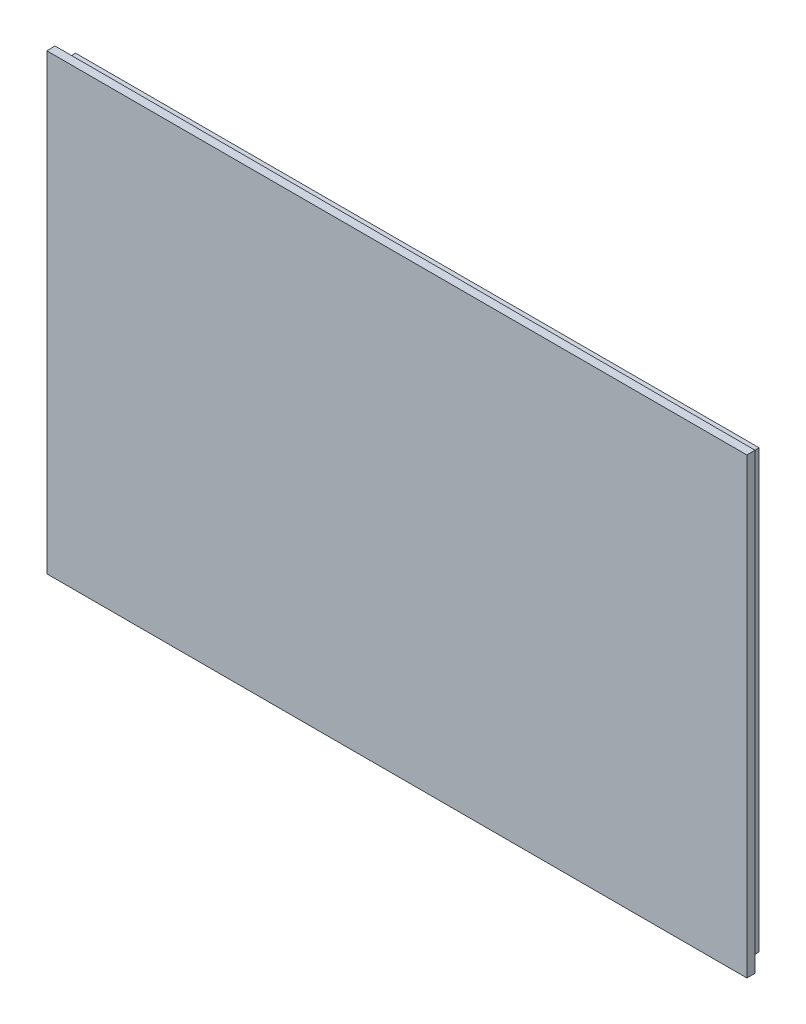
ISO-10303-21;
HEADER;
FILE_DESCRIPTION(('STEP AP214'),'2;1');
FILE_NAME('part.step','',(''),(''),'','','');
FILE_SCHEMA(('AUTOMOTIVE_DESIGN { 1 0 10303 214 1 1 1 1 }'));
ENDSEC;
DATA;
#1=APPLICATION_CONTEXT('core data for automotive mechanical design processes');
#2=APPLICATION_PROTOCOL_DEFINITION('international standard','automotive_design',2000,#1);
#3=PRODUCT_CONTEXT('',#1,'mechanical');
#4=PRODUCT('Part','Part','',(#3));
#5=PRODUCT_RELATED_PRODUCT_CATEGORY('part','',(#4));
#6=PRODUCT_DEFINITION_FORMATION('','',#4);
#7=PRODUCT_DEFINITION_CONTEXT('part definition',#1,'design');
#8=PRODUCT_DEFINITION('design','',#6,#7);
#9=PRODUCT_DEFINITION_SHAPE('','',#8);
#10=(LENGTH_UNIT() NAMED_UNIT(*) SI_UNIT(.MILLI.,.METRE.));
#11=(NAMED_UNIT(*) PLANE_ANGLE_UNIT() SI_UNIT($,.RADIAN.));
#12=(NAMED_UNIT(*) SI_UNIT($,.STERADIAN.) SOLID_ANGLE_UNIT());
#13=UNCERTAINTY_MEASURE_WITH_UNIT(LENGTH_MEASURE(1.E-05),#10,'distance_accuracy_value','');
#14=(GEOMETRIC_REPRESENTATION_CONTEXT(3) GLOBAL_UNCERTAINTY_ASSIGNED_CONTEXT((#13)) GLOBAL_UNIT_ASSIGNED_CONTEXT((#10,
#11,#12)) REPRESENTATION_CONTEXT('',''));
#15=CARTESIAN_POINT('',(0.,0.,0.));
#16=DIRECTION('',(0.,0.,1.));
#17=DIRECTION('',(1.,0.,0.));
#18=AXIS2_PLACEMENT_3D('',#15,#16,#17);
#19=CARTESIAN_POINT('',(85.,55.,2.));
#20=DIRECTION('',(-1.,0.,0.));
#21=DIRECTION('',(0.,-1.,0.));
#22=AXIS2_PLACEMENT_3D('',#19,#20,#21);
#23=PLANE('',#22);
#24=DIRECTION('',(0.,1.,0.));
#25=VECTOR('',#24,1.);
#26=CARTESIAN_POINT('',(85.,55.,0.));
#27=LINE('',#26,#25);
#28=CARTESIAN_POINT('',(85.,-55.,0.));
#29=VERTEX_POINT('',#28);
#30=CARTESIAN_POINT('',(85.,55.,0.));
#31=VERTEX_POINT('',#30);
#32=EDGE_CURVE('E174',#29,#31,#27,.T.);
#33=ORIENTED_EDGE('',*,*,#32,.T.);
#34=DIRECTION('',(0.,0.,-1.));
#35=VECTOR('',#34,1.);
#36=CARTESIAN_POINT('',(85.,55.,2.));
#37=LINE('',#36,#35);
#38=CARTESIAN_POINT('',(85.,55.,2.));
#39=VERTEX_POINT('',#38);
#40=EDGE_CURVE('E207',#39,#31,#37,.T.);
#41=ORIENTED_EDGE('',*,*,#40,.F.);
#42=DIRECTION('',(0.,1.,0.));
#43=VECTOR('',#42,1.);
#44=CARTESIAN_POINT('',(85.,55.,2.));
#45=LINE('',#44,#43);
#46=CARTESIAN_POINT('',(85.,-55.,2.));
#47=VERTEX_POINT('',#46);
#48=EDGE_CURVE('E181',#47,#39,#45,.T.);
#49=ORIENTED_EDGE('',*,*,#48,.F.);
#50=DIRECTION('',(0.,0.,-1.));
#51=VECTOR('',#50,1.);
#52=CARTESIAN_POINT('',(85.,-55.,2.));
#53=LINE('',#52,#51);
#54=EDGE_CURVE('E191',#47,#29,#53,.T.);
#55=ORIENTED_EDGE('',*,*,#54,.T.);
#56=EDGE_LOOP('',(#33,#41,#49,#55));
#57=FACE_BOUND('',#56,.T.);
#58=ADVANCED_FACE('F37',(#57),#23,.F.);
#59=CARTESIAN_POINT('',(-85.,55.,2.));
#60=DIRECTION('',(0.,-1.,0.));
#61=DIRECTION('',(0.,0.,-1.));
#62=AXIS2_PLACEMENT_3D('',#59,#60,#61);
#63=PLANE('',#62);
#64=DIRECTION('',(-1.,0.,0.));
#65=VECTOR('',#64,1.);
#66=CARTESIAN_POINT('',(-85.,55.,0.));
#67=LINE('',#66,#65);
#68=CARTESIAN_POINT('',(-85.,55.,0.));
#69=VERTEX_POINT('',#68);
#70=EDGE_CURVE('E194',#31,#69,#67,.T.);
#71=ORIENTED_EDGE('',*,*,#70,.T.);
#72=DIRECTION('',(0.,0.,-1.));
#73=VECTOR('',#72,1.);
#74=CARTESIAN_POINT('',(-85.,55.,2.));
#75=LINE('',#74,#73);
#76=CARTESIAN_POINT('',(-85.,55.,2.));
#77=VERTEX_POINT('',#76);
#78=EDGE_CURVE('E204',#77,#69,#75,.T.);
#79=ORIENTED_EDGE('',*,*,#78,.F.);
#80=DIRECTION('',(-1.,0.,0.));
#81=VECTOR('',#80,1.);
#82=CARTESIAN_POINT('',(-85.,55.,2.));
#83=LINE('',#82,#81);
#84=EDGE_CURVE('E184',#39,#77,#83,.T.);
#85=ORIENTED_EDGE('',*,*,#84,.F.);
#86=ORIENTED_EDGE('',*,*,#40,.T.);
#87=EDGE_LOOP('',(#71,#79,#85,#86));
#88=FACE_BOUND('',#87,.T.);
#89=ADVANCED_FACE('F249',(#88),#63,.F.);
#90=CARTESIAN_POINT('',(-85.,55.,2.));
#91=DIRECTION('',(1.,0.,0.));
#92=DIRECTION('',(0.,1.,0.));
#93=AXIS2_PLACEMENT_3D('',#90,#91,#92);
#94=PLANE('',#93);
#95=DIRECTION('',(0.,-1.,0.));
#96=VECTOR('',#95,1.);
#97=CARTESIAN_POINT('',(-85.,55.,0.));
#98=LINE('',#97,#96);
#99=CARTESIAN_POINT('',(-85.,-55.,0.));
#100=VERTEX_POINT('',#99);
#101=EDGE_CURVE('E196',#69,#100,#98,.T.);
#102=ORIENTED_EDGE('',*,*,#101,.T.);
#103=DIRECTION('',(0.,0.,-1.));
#104=VECTOR('',#103,1.);
#105=CARTESIAN_POINT('',(-85.,-55.,2.));
#106=LINE('',#105,#104);
#107=CARTESIAN_POINT('',(-85.,-55.,2.));
#108=VERTEX_POINT('',#107);
#109=EDGE_CURVE('E201',#108,#100,#106,.T.);
#110=ORIENTED_EDGE('',*,*,#109,.F.);
#111=DIRECTION('',(0.,-1.,0.));
#112=VECTOR('',#111,1.);
#113=CARTESIAN_POINT('',(-85.,55.,2.));
#114=LINE('',#113,#112);
#115=EDGE_CURVE('E187',#77,#108,#114,.T.);
#116=ORIENTED_EDGE('',*,*,#115,.F.);
#117=ORIENTED_EDGE('',*,*,#78,.T.);
#118=EDGE_LOOP('',(#102,#110,#116,#117));
#119=FACE_BOUND('',#118,.T.);
#120=ADVANCED_FACE('F254',(#119),#94,.F.);
#121=CARTESIAN_POINT('',(-85.,-55.,2.));
#122=DIRECTION('',(0.,1.,0.));
#123=DIRECTION('',(0.,0.,1.));
#124=AXIS2_PLACEMENT_3D('',#121,#122,#123);
#125=PLANE('',#124);
#126=DIRECTION('',(1.,0.,0.));
#127=VECTOR('',#126,1.);
#128=CARTESIAN_POINT('',(-85.,-55.,0.));
#129=LINE('',#128,#127);
#130=EDGE_CURVE('E185',#100,#29,#129,.T.);
#131=ORIENTED_EDGE('',*,*,#130,.T.);
#132=ORIENTED_EDGE('',*,*,#54,.F.);
#133=DIRECTION('',(1.,0.,0.));
#134=VECTOR('',#133,1.);
#135=CARTESIAN_POINT('',(-85.,-55.,2.));
#136=LINE('',#135,#134);
#137=EDGE_CURVE('E189',#108,#47,#136,.T.);
#138=ORIENTED_EDGE('',*,*,#137,.F.);
#139=ORIENTED_EDGE('',*,*,#109,.T.);
#140=EDGE_LOOP('',(#131,#132,#138,#139));
#141=FACE_BOUND('',#140,.T.);
#142=ADVANCED_FACE('F269',(#141),#125,.F.);
#143=CARTESIAN_POINT('',(0.,0.,2.));
#144=DIRECTION('',(0.,0.,1.));
#145=DIRECTION('',(1.,0.,0.));
#146=AXIS2_PLACEMENT_3D('',#143,#144,#145);
#147=PLANE('',#146);
#148=ORIENTED_EDGE('',*,*,#48,.T.);
#149=ORIENTED_EDGE('',*,*,#84,.T.);
#150=ORIENTED_EDGE('',*,*,#115,.T.);
#151=ORIENTED_EDGE('',*,*,#137,.T.);
#152=EDGE_LOOP('',(#148,#149,#150,#151));
#153=FACE_BOUND('',#152,.T.);
#154=ADVANCED_FACE('F265',(#153),#147,.T.);
#155=CARTESIAN_POINT('',(0.,0.,0.));
#156=DIRECTION('',(0.,0.,1.));
#157=DIRECTION('',(1.,0.,0.));
#158=AXIS2_PLACEMENT_3D('',#155,#156,#157);
#159=PLANE('',#158);
#160=DIRECTION('',(0.,-1.,0.));
#161=VECTOR('',#160,1.);
#162=CARTESIAN_POINT('',(-83.,0.,0.));
#163=LINE('',#162,#161);
#164=CARTESIAN_POINT('',(-83.,53.,0.));
#165=VERTEX_POINT('',#164);
#166=CARTESIAN_POINT('',(-83.,-53.,0.));
#167=VERTEX_POINT('',#166);
#168=EDGE_CURVE('E44',#165,#167,#163,.T.);
#169=ORIENTED_EDGE('',*,*,#168,.T.);
#170=DIRECTION('',(1.,0.,0.));
#171=VECTOR('',#170,1.);
#172=CARTESIAN_POINT('',(0.,-53.,0.));
#173=LINE('',#172,#171);
#174=CARTESIAN_POINT('',(83.,-53.,0.));
#175=VERTEX_POINT('',#174);
#176=EDGE_CURVE('E11',#167,#175,#173,.T.);
#177=ORIENTED_EDGE('',*,*,#176,.T.);
#178=DIRECTION('',(0.,1.,0.));
#179=VECTOR('',#178,1.);
#180=CARTESIAN_POINT('',(83.,0.,0.));
#181=LINE('',#180,#179);
#182=CARTESIAN_POINT('',(83.,53.,0.));
#183=VERTEX_POINT('',#182);
#184=EDGE_CURVE('E218',#175,#183,#181,.T.);
#185=ORIENTED_EDGE('',*,*,#184,.T.);
#186=DIRECTION('',(-1.,0.,0.));
#187=VECTOR('',#186,1.);
#188=CARTESIAN_POINT('',(0.,53.,0.));
#189=LINE('',#188,#187);
#190=EDGE_CURVE('E221',#183,#165,#189,.T.);
#191=ORIENTED_EDGE('',*,*,#190,.T.);
#192=EDGE_LOOP('',(#169,#177,#185,#191));
#193=FACE_BOUND('',#192,.T.);
#194=ORIENTED_EDGE('',*,*,#32,.F.);
#195=ORIENTED_EDGE('',*,*,#130,.F.);
#196=ORIENTED_EDGE('',*,*,#101,.F.);
#197=ORIENTED_EDGE('',*,*,#70,.F.);
#198=EDGE_LOOP('',(#194,#195,#196,#197));
#199=FACE_BOUND('',#198,.T.);
#200=ADVANCED_FACE('F225',(#193,#199),#159,.F.);
#201=CARTESIAN_POINT('',(-83.,-53.,-3.));
#202=DIRECTION('',(0.,-1.,0.));
#203=DIRECTION('',(0.,0.,-1.));
#204=AXIS2_PLACEMENT_3D('',#201,#202,#203);
#205=PLANE('',#204);
#206=ORIENTED_EDGE('',*,*,#176,.F.);
#207=DIRECTION('',(0.,0.,1.));
#208=VECTOR('',#207,1.);
#209=CARTESIAN_POINT('',(-83.,-53.,-3.));
#210=LINE('',#209,#208);
#211=CARTESIAN_POINT('',(-83.,-53.,-3.));
#212=VERTEX_POINT('',#211);
#213=EDGE_CURVE('E171',#212,#167,#210,.T.);
#214=ORIENTED_EDGE('',*,*,#213,.F.);
#215=DIRECTION('',(1.,0.,0.));
#216=VECTOR('',#215,1.);
#217=CARTESIAN_POINT('',(-83.,-53.,-3.));
#218=LINE('',#217,#216);
#219=CARTESIAN_POINT('',(83.,-53.,-3.));
#220=VERTEX_POINT('',#219);
#221=EDGE_CURVE('E155',#212,#220,#218,.T.);
#222=ORIENTED_EDGE('',*,*,#221,.T.);
#223=DIRECTION('',(0.,0.,1.));
#224=VECTOR('',#223,1.);
#225=CARTESIAN_POINT('',(83.,-53.,-3.));
#226=LINE('',#225,#224);
#227=EDGE_CURVE('E170',#220,#175,#226,.T.);
#228=ORIENTED_EDGE('',*,*,#227,.T.);
#229=EDGE_LOOP('',(#206,#214,#222,#228));
#230=FACE_BOUND('',#229,.T.);
#231=ADVANCED_FACE('F236',(#230),#205,.T.);
#232=CARTESIAN_POINT('',(-83.,53.,-3.));
#233=DIRECTION('',(-1.,0.,0.));
#234=DIRECTION('',(0.,-1.,0.));
#235=AXIS2_PLACEMENT_3D('',#232,#233,#234);
#236=PLANE('',#235);
#237=ORIENTED_EDGE('',*,*,#168,.F.);
#238=DIRECTION('',(0.,0.,1.));
#239=VECTOR('',#238,1.);
#240=CARTESIAN_POINT('',(-83.,53.,-3.));
#241=LINE('',#240,#239);
#242=CARTESIAN_POINT('',(-83.,53.,-3.));
#243=VERTEX_POINT('',#242);
#244=EDGE_CURVE('E175',#243,#165,#241,.T.);
#245=ORIENTED_EDGE('',*,*,#244,.F.);
#246=DIRECTION('',(0.,-1.,0.));
#247=VECTOR('',#246,1.);
#248=CARTESIAN_POINT('',(-83.,53.,-3.));
#249=LINE('',#248,#247);
#250=EDGE_CURVE('E167',#243,#212,#249,.T.);
#251=ORIENTED_EDGE('',*,*,#250,.T.);
#252=ORIENTED_EDGE('',*,*,#213,.T.);
#253=EDGE_LOOP('',(#237,#245,#251,#252));
#254=FACE_BOUND('',#253,.T.);
#255=ADVANCED_FACE('F228',(#254),#236,.T.);
#256=CARTESIAN_POINT('',(83.,53.,-3.));
#257=DIRECTION('',(0.,1.,0.));
#258=DIRECTION('',(0.,0.,1.));
#259=AXIS2_PLACEMENT_3D('',#256,#257,#258);
#260=PLANE('',#259);
#261=ORIENTED_EDGE('',*,*,#190,.F.);
#262=DIRECTION('',(0.,0.,1.));
#263=VECTOR('',#262,1.);
#264=CARTESIAN_POINT('',(83.,53.,-3.));
#265=LINE('',#264,#263);
#266=CARTESIAN_POINT('',(83.,53.,-3.));
#267=VERTEX_POINT('',#266);
#268=EDGE_CURVE('E51',#267,#183,#265,.T.);
#269=ORIENTED_EDGE('',*,*,#268,.F.);
#270=DIRECTION('',(-1.,0.,0.));
#271=VECTOR('',#270,1.);
#272=CARTESIAN_POINT('',(83.,53.,-3.));
#273=LINE('',#272,#271);
#274=EDGE_CURVE('E164',#267,#243,#273,.T.);
#275=ORIENTED_EDGE('',*,*,#274,.T.);
#276=ORIENTED_EDGE('',*,*,#244,.T.);
#277=EDGE_LOOP('',(#261,#269,#275,#276));
#278=FACE_BOUND('',#277,.T.);
#279=ADVANCED_FACE('F230',(#278),#260,.T.);
#280=CARTESIAN_POINT('',(83.,-53.,-3.));
#281=DIRECTION('',(1.,0.,0.));
#282=DIRECTION('',(0.,1.,0.));
#283=AXIS2_PLACEMENT_3D('',#280,#281,#282);
#284=PLANE('',#283);
#285=ORIENTED_EDGE('',*,*,#184,.F.);
#286=ORIENTED_EDGE('',*,*,#227,.F.);
#287=DIRECTION('',(0.,1.,0.));
#288=VECTOR('',#287,1.);
#289=CARTESIAN_POINT('',(83.,-53.,-3.));
#290=LINE('',#289,#288);
#291=EDGE_CURVE('E162',#220,#267,#290,.T.);
#292=ORIENTED_EDGE('',*,*,#291,.T.);
#293=ORIENTED_EDGE('',*,*,#268,.T.);
#294=EDGE_LOOP('',(#285,#286,#292,#293));
#295=FACE_BOUND('',#294,.T.);
#296=ADVANCED_FACE('F237',(#295),#284,.T.);
#297=CARTESIAN_POINT('',(-80.,-50.,-3.));
#298=DIRECTION('',(0.,-1.,0.));
#299=DIRECTION('',(0.,0.,-1.));
#300=AXIS2_PLACEMENT_3D('',#297,#298,#299);
#301=PLANE('',#300);
#302=DIRECTION('',(0.,0.,1.));
#303=VECTOR('',#302,1.);
#304=CARTESIAN_POINT('',(-80.,-50.,-3.));
#305=LINE('',#304,#303);
#306=CARTESIAN_POINT('',(-80.,-50.,-3.));
#307=VERTEX_POINT('',#306);
#308=CARTESIAN_POINT('',(-80.,-50.,0.));
#309=VERTEX_POINT('',#308);
#310=EDGE_CURVE('E153',#307,#309,#305,.T.);
#311=ORIENTED_EDGE('',*,*,#310,.T.);
#312=DIRECTION('',(1.,0.,0.));
#313=VECTOR('',#312,1.);
#314=CARTESIAN_POINT('',(0.,-50.,0.));
#315=LINE('',#314,#313);
#316=CARTESIAN_POINT('',(80.,-50.,0.));
#317=VERTEX_POINT('',#316);
#318=EDGE_CURVE('E59',#309,#317,#315,.T.);
#319=ORIENTED_EDGE('',*,*,#318,.T.);
#320=DIRECTION('',(0.,0.,1.));
#321=VECTOR('',#320,1.);
#322=CARTESIAN_POINT('',(80.,-50.,-3.));
#323=LINE('',#322,#321);
#324=CARTESIAN_POINT('',(80.,-50.,-3.));
#325=VERTEX_POINT('',#324);
#326=EDGE_CURVE('E125',#325,#317,#323,.T.);
#327=ORIENTED_EDGE('',*,*,#326,.F.);
#328=DIRECTION('',(1.,0.,0.));
#329=VECTOR('',#328,1.);
#330=CARTESIAN_POINT('',(-80.,-50.,-3.));
#331=LINE('',#330,#329);
#332=EDGE_CURVE('E130',#307,#325,#331,.T.);
#333=ORIENTED_EDGE('',*,*,#332,.F.);
#334=EDGE_LOOP('',(#311,#319,#327,#333));
#335=FACE_BOUND('',#334,.T.);
#336=ADVANCED_FACE('F128',(#335),#301,.F.);
#337=CARTESIAN_POINT('',(-80.,50.,-3.));
#338=DIRECTION('',(-1.,0.,0.));
#339=DIRECTION('',(0.,0.,1.));
#340=AXIS2_PLACEMENT_3D('',#337,#338,#339);
#341=PLANE('',#340);
#342=DIRECTION('',(0.,0.,1.));
#343=VECTOR('',#342,1.);
#344=CARTESIAN_POINT('',(-80.,50.,-3.));
#345=LINE('',#344,#343);
#346=CARTESIAN_POINT('',(-80.,50.,-3.));
#347=VERTEX_POINT('',#346);
#348=CARTESIAN_POINT('',(-80.,50.,0.));
#349=VERTEX_POINT('',#348);
#350=EDGE_CURVE('E156',#347,#349,#345,.T.);
#351=ORIENTED_EDGE('',*,*,#350,.T.);
#352=DIRECTION('',(0.,-1.,0.));
#353=VECTOR('',#352,1.);
#354=CARTESIAN_POINT('',(-80.,0.,0.));
#355=LINE('',#354,#353);
#356=EDGE_CURVE('E215',#349,#309,#355,.T.);
#357=ORIENTED_EDGE('',*,*,#356,.T.);
#358=ORIENTED_EDGE('',*,*,#310,.F.);
#359=DIRECTION('',(0.,-1.,0.));
#360=VECTOR('',#359,1.);
#361=CARTESIAN_POINT('',(-80.,50.,-3.));
#362=LINE('',#361,#360);
#363=EDGE_CURVE('E135',#347,#307,#362,.T.);
#364=ORIENTED_EDGE('',*,*,#363,.F.);
#365=EDGE_LOOP('',(#351,#357,#358,#364));
#366=FACE_BOUND('',#365,.T.);
#367=ADVANCED_FACE('F244',(#366),#341,.F.);
#368=CARTESIAN_POINT('',(80.,50.,-3.));
#369=DIRECTION('',(0.,1.,0.));
#370=DIRECTION('',(0.,0.,1.));
#371=AXIS2_PLACEMENT_3D('',#368,#369,#370);
#372=PLANE('',#371);
#373=DIRECTION('',(0.,0.,1.));
#374=VECTOR('',#373,1.);
#375=CARTESIAN_POINT('',(80.,50.,-3.));
#376=LINE('',#375,#374);
#377=CARTESIAN_POINT('',(80.,50.,-3.));
#378=VERTEX_POINT('',#377);
#379=CARTESIAN_POINT('',(80.,50.,0.));
#380=VERTEX_POINT('',#379);
#381=EDGE_CURVE('E134',#378,#380,#376,.T.);
#382=ORIENTED_EDGE('',*,*,#381,.T.);
#383=DIRECTION('',(-1.,0.,0.));
#384=VECTOR('',#383,1.);
#385=CARTESIAN_POINT('',(0.,50.,0.));
#386=LINE('',#385,#384);
#387=EDGE_CURVE('E212',#380,#349,#386,.T.);
#388=ORIENTED_EDGE('',*,*,#387,.T.);
#389=ORIENTED_EDGE('',*,*,#350,.F.);
#390=DIRECTION('',(-1.,0.,0.));
#391=VECTOR('',#390,1.);
#392=CARTESIAN_POINT('',(80.,50.,-3.));
#393=LINE('',#392,#391);
#394=EDGE_CURVE('E144',#378,#347,#393,.T.);
#395=ORIENTED_EDGE('',*,*,#394,.F.);
#396=EDGE_LOOP('',(#382,#388,#389,#395));
#397=FACE_BOUND('',#396,.T.);
#398=ADVANCED_FACE('F294',(#397),#372,.F.);
#399=CARTESIAN_POINT('',(80.,-50.,-3.));
#400=DIRECTION('',(1.,0.,0.));
#401=DIRECTION('',(0.,0.,-1.));
#402=AXIS2_PLACEMENT_3D('',#399,#400,#401);
#403=PLANE('',#402);
#404=ORIENTED_EDGE('',*,*,#326,.T.);
#405=DIRECTION('',(0.,1.,0.));
#406=VECTOR('',#405,1.);
#407=CARTESIAN_POINT('',(80.,0.,0.));
#408=LINE('',#407,#406);
#409=EDGE_CURVE('E210',#317,#380,#408,.T.);
#410=ORIENTED_EDGE('',*,*,#409,.T.);
#411=ORIENTED_EDGE('',*,*,#381,.F.);
#412=DIRECTION('',(0.,1.,0.));
#413=VECTOR('',#412,1.);
#414=CARTESIAN_POINT('',(80.,-50.,-3.));
#415=LINE('',#414,#413);
#416=EDGE_CURVE('E139',#325,#378,#415,.T.);
#417=ORIENTED_EDGE('',*,*,#416,.F.);
#418=EDGE_LOOP('',(#404,#410,#411,#417));
#419=FACE_BOUND('',#418,.T.);
#420=ADVANCED_FACE('F140',(#419),#403,.F.);
#421=CARTESIAN_POINT('',(0.,0.,-3.));
#422=DIRECTION('',(0.,0.,1.));
#423=DIRECTION('',(1.,0.,0.));
#424=AXIS2_PLACEMENT_3D('',#421,#422,#423);
#425=PLANE('',#424);
#426=ORIENTED_EDGE('',*,*,#363,.T.);
#427=ORIENTED_EDGE('',*,*,#332,.T.);
#428=ORIENTED_EDGE('',*,*,#416,.T.);
#429=ORIENTED_EDGE('',*,*,#394,.T.);
#430=EDGE_LOOP('',(#426,#427,#428,#429));
#431=FACE_BOUND('',#430,.T.);
#432=ORIENTED_EDGE('',*,*,#221,.F.);
#433=ORIENTED_EDGE('',*,*,#250,.F.);
#434=ORIENTED_EDGE('',*,*,#274,.F.);
#435=ORIENTED_EDGE('',*,*,#291,.F.);
#436=EDGE_LOOP('',(#432,#433,#434,#435));
#437=FACE_BOUND('',#436,.T.);
#438=ADVANCED_FACE('F146',(#431,#437),#425,.F.);
#439=ORIENTED_EDGE('',*,*,#318,.F.);
#440=ORIENTED_EDGE('',*,*,#356,.F.);
#441=ORIENTED_EDGE('',*,*,#387,.F.);
#442=ORIENTED_EDGE('',*,*,#409,.F.);
#443=EDGE_LOOP('',(#439,#440,#441,#442));
#444=FACE_BOUND('',#443,.T.);
#445=ADVANCED_FACE('F280',(#444),#159,.F.);
#446=CLOSED_SHELL('',(#58,#89,#120,#142,#154,#200,#231,#255,#279,#296,#336,#367,#398,#420,#438,#445));
#447=MANIFOLD_SOLID_BREP('B2',#446);
#448=ADVANCED_BREP_SHAPE_REPRESENTATION('',(#18,#447),#14);
#449=SHAPE_DEFINITION_REPRESENTATION(#9,#448);
ENDSEC;
END-ISO-10303-21;
